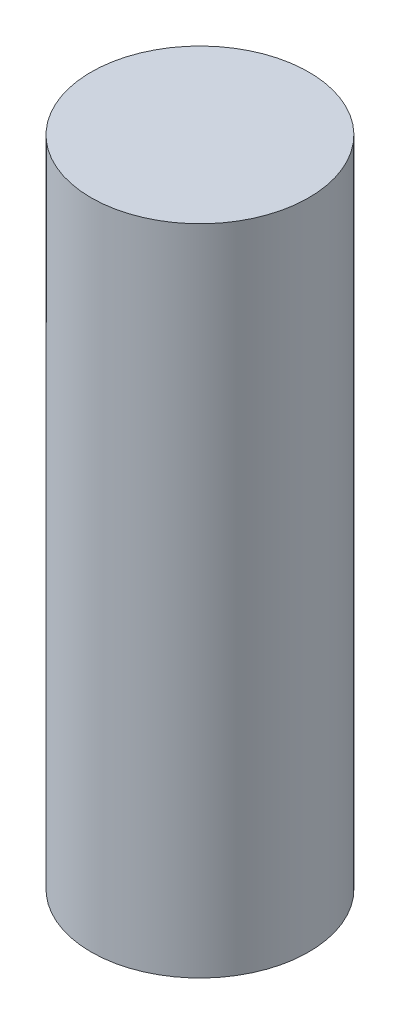
ISO-10303-21;
HEADER;
FILE_DESCRIPTION(('STEP AP214'),'2;1');
FILE_NAME('part.step','',(''),(''),'','','');
FILE_SCHEMA(('AUTOMOTIVE_DESIGN { 1 0 10303 214 1 1 1 1 }'));
ENDSEC;
DATA;
#1=APPLICATION_CONTEXT('core data for automotive mechanical design processes');
#2=APPLICATION_PROTOCOL_DEFINITION('international standard','automotive_design',2000,#1);
#3=PRODUCT_CONTEXT('',#1,'mechanical');
#4=PRODUCT('Part','Part','',(#3));
#5=PRODUCT_RELATED_PRODUCT_CATEGORY('part','',(#4));
#6=PRODUCT_DEFINITION_FORMATION('','',#4);
#7=PRODUCT_DEFINITION_CONTEXT('part definition',#1,'design');
#8=PRODUCT_DEFINITION('design','',#6,#7);
#9=PRODUCT_DEFINITION_SHAPE('','',#8);
#10=(LENGTH_UNIT() NAMED_UNIT(*) SI_UNIT(.MILLI.,.METRE.));
#11=(NAMED_UNIT(*) PLANE_ANGLE_UNIT() SI_UNIT($,.RADIAN.));
#12=(NAMED_UNIT(*) SI_UNIT($,.STERADIAN.) SOLID_ANGLE_UNIT());
#13=UNCERTAINTY_MEASURE_WITH_UNIT(LENGTH_MEASURE(1.E-05),#10,'distance_accuracy_value','');
#14=(GEOMETRIC_REPRESENTATION_CONTEXT(3) GLOBAL_UNCERTAINTY_ASSIGNED_CONTEXT((#13)) GLOBAL_UNIT_ASSIGNED_CONTEXT((#10,
#11,#12)) REPRESENTATION_CONTEXT('',''));
#15=CARTESIAN_POINT('',(0.,0.,0.));
#16=DIRECTION('',(0.,0.,1.));
#17=DIRECTION('',(1.,0.,0.));
#18=AXIS2_PLACEMENT_3D('',#15,#16,#17);
#19=CARTESIAN_POINT('',(0.,30.,0.));
#20=DIRECTION('',(0.,-1.,0.));
#21=DIRECTION('',(0.,0.,-1.));
#22=AXIS2_PLACEMENT_3D('',#19,#20,#21);
#23=CYLINDRICAL_SURFACE('',#22,5.);
#24=CARTESIAN_POINT('',(0.,30.,0.));
#25=DIRECTION('',(0.,1.,0.));
#26=DIRECTION('',(0.,0.,1.));
#27=AXIS2_PLACEMENT_3D('',#24,#25,#26);
#28=CIRCLE('',#27,5.);
#29=CARTESIAN_POINT('',(0.,30.,5.));
#30=VERTEX_POINT('',#29);
#31=EDGE_CURVE('E10',#30,#30,#28,.T.);
#32=ORIENTED_EDGE('',*,*,#31,.F.);
#33=EDGE_LOOP('',(#32));
#34=FACE_BOUND('',#33,.T.);
#35=CARTESIAN_POINT('',(0.,0.,0.));
#36=DIRECTION('',(0.,1.,0.));
#37=DIRECTION('',(0.,0.,1.));
#38=AXIS2_PLACEMENT_3D('',#35,#36,#37);
#39=CIRCLE('',#38,5.);
#40=CARTESIAN_POINT('',(0.,0.,5.));
#41=VERTEX_POINT('',#40);
#42=EDGE_CURVE('E34',#41,#41,#39,.T.);
#43=ORIENTED_EDGE('',*,*,#42,.T.);
#44=EDGE_LOOP('',(#43));
#45=FACE_BOUND('',#44,.T.);
#46=ADVANCED_FACE('F31',(#34,#45),#23,.T.);
#47=CARTESIAN_POINT('',(0.,30.,0.));
#48=DIRECTION('',(0.,1.,0.));
#49=DIRECTION('',(0.,0.,1.));
#50=AXIS2_PLACEMENT_3D('',#47,#48,#49);
#51=PLANE('',#50);
#52=ORIENTED_EDGE('',*,*,#31,.T.);
#53=EDGE_LOOP('',(#52));
#54=FACE_BOUND('',#53,.T.);
#55=ADVANCED_FACE('F46',(#54),#51,.T.);
#56=CARTESIAN_POINT('',(0.,0.,0.));
#57=DIRECTION('',(0.,1.,0.));
#58=DIRECTION('',(0.,0.,1.));
#59=AXIS2_PLACEMENT_3D('',#56,#57,#58);
#60=PLANE('',#59);
#61=ORIENTED_EDGE('',*,*,#42,.F.);
#62=EDGE_LOOP('',(#61));
#63=FACE_BOUND('',#62,.T.);
#64=ADVANCED_FACE('F44',(#63),#60,.F.);
#65=CLOSED_SHELL('',(#46,#55,#64));
#66=MANIFOLD_SOLID_BREP('B2',#65);
#67=ADVANCED_BREP_SHAPE_REPRESENTATION('',(#18,#66),#14);
#68=SHAPE_DEFINITION_REPRESENTATION(#9,#67);
ENDSEC;
END-ISO-10303-21;
